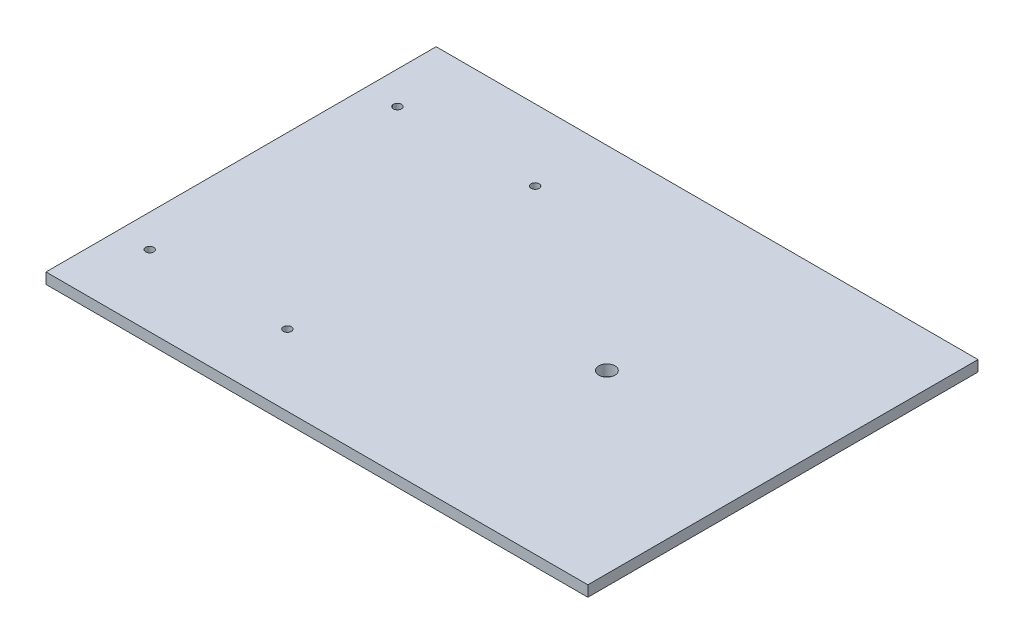
ISO-10303-21;
HEADER;
FILE_DESCRIPTION(('STEP AP214'),'2;1');
FILE_NAME('part.step','',(''),(''),'','','');
FILE_SCHEMA(('AUTOMOTIVE_DESIGN { 1 0 10303 214 1 1 1 1 }'));
ENDSEC;
DATA;
#1=APPLICATION_CONTEXT('core data for automotive mechanical design processes');
#2=APPLICATION_PROTOCOL_DEFINITION('international standard','automotive_design',2000,#1);
#3=PRODUCT_CONTEXT('',#1,'mechanical');
#4=PRODUCT('Part','Part','',(#3));
#5=PRODUCT_RELATED_PRODUCT_CATEGORY('part','',(#4));
#6=PRODUCT_DEFINITION_FORMATION('','',#4);
#7=PRODUCT_DEFINITION_CONTEXT('part definition',#1,'design');
#8=PRODUCT_DEFINITION('design','',#6,#7);
#9=PRODUCT_DEFINITION_SHAPE('','',#8);
#10=(LENGTH_UNIT() NAMED_UNIT(*) SI_UNIT(.MILLI.,.METRE.));
#11=(NAMED_UNIT(*) PLANE_ANGLE_UNIT() SI_UNIT($,.RADIAN.));
#12=(NAMED_UNIT(*) SI_UNIT($,.STERADIAN.) SOLID_ANGLE_UNIT());
#13=UNCERTAINTY_MEASURE_WITH_UNIT(LENGTH_MEASURE(1.E-05),#10,'distance_accuracy_value','');
#14=(GEOMETRIC_REPRESENTATION_CONTEXT(3) GLOBAL_UNCERTAINTY_ASSIGNED_CONTEXT((#13)) GLOBAL_UNIT_ASSIGNED_CONTEXT((#10,
#11,#12)) REPRESENTATION_CONTEXT('',''));
#15=CARTESIAN_POINT('',(0.,0.,0.));
#16=DIRECTION('',(0.,0.,1.));
#17=DIRECTION('',(1.,0.,0.));
#18=AXIS2_PLACEMENT_3D('',#15,#16,#17);
#19=CARTESIAN_POINT('',(-100.,4.,72.));
#20=DIRECTION('',(1.,0.,0.));
#21=DIRECTION('',(0.,0.,-1.));
#22=AXIS2_PLACEMENT_3D('',#19,#20,#21);
#23=PLANE('',#22);
#24=DIRECTION('',(0.,0.,1.));
#25=VECTOR('',#24,1.);
#26=CARTESIAN_POINT('',(-100.,0.,72.));
#27=LINE('',#26,#25);
#28=CARTESIAN_POINT('',(-100.,0.,-72.));
#29=VERTEX_POINT('',#28);
#30=CARTESIAN_POINT('',(-100.,0.,72.));
#31=VERTEX_POINT('',#30);
#32=EDGE_CURVE('E117',#29,#31,#27,.T.);
#33=ORIENTED_EDGE('',*,*,#32,.T.);
#34=DIRECTION('',(0.,-1.,0.));
#35=VECTOR('',#34,1.);
#36=CARTESIAN_POINT('',(-100.,4.,72.));
#37=LINE('',#36,#35);
#38=CARTESIAN_POINT('',(-100.,4.,72.));
#39=VERTEX_POINT('',#38);
#40=EDGE_CURVE('E12',#39,#31,#37,.T.);
#41=ORIENTED_EDGE('',*,*,#40,.F.);
#42=DIRECTION('',(0.,0.,1.));
#43=VECTOR('',#42,1.);
#44=CARTESIAN_POINT('',(-100.,4.,72.));
#45=LINE('',#44,#43);
#46=CARTESIAN_POINT('',(-100.,4.,-72.));
#47=VERTEX_POINT('',#46);
#48=EDGE_CURVE('E97',#47,#39,#45,.T.);
#49=ORIENTED_EDGE('',*,*,#48,.F.);
#50=DIRECTION('',(0.,-1.,0.));
#51=VECTOR('',#50,1.);
#52=CARTESIAN_POINT('',(-100.,4.,-72.));
#53=LINE('',#52,#51);
#54=EDGE_CURVE('E110',#47,#29,#53,.T.);
#55=ORIENTED_EDGE('',*,*,#54,.T.);
#56=EDGE_LOOP('',(#33,#41,#49,#55));
#57=FACE_BOUND('',#56,.T.);
#58=ADVANCED_FACE('F45',(#57),#23,.F.);
#59=CARTESIAN_POINT('',(100.,4.,72.));
#60=DIRECTION('',(0.,0.,-1.));
#61=DIRECTION('',(-1.,0.,0.));
#62=AXIS2_PLACEMENT_3D('',#59,#60,#61);
#63=PLANE('',#62);
#64=DIRECTION('',(1.,0.,0.));
#65=VECTOR('',#64,1.);
#66=CARTESIAN_POINT('',(100.,0.,72.));
#67=LINE('',#66,#65);
#68=CARTESIAN_POINT('',(100.,0.,72.));
#69=VERTEX_POINT('',#68);
#70=EDGE_CURVE('E102',#31,#69,#67,.T.);
#71=ORIENTED_EDGE('',*,*,#70,.T.);
#72=DIRECTION('',(0.,-1.,0.));
#73=VECTOR('',#72,1.);
#74=CARTESIAN_POINT('',(100.,4.,72.));
#75=LINE('',#74,#73);
#76=CARTESIAN_POINT('',(100.,4.,72.));
#77=VERTEX_POINT('',#76);
#78=EDGE_CURVE('E54',#77,#69,#75,.T.);
#79=ORIENTED_EDGE('',*,*,#78,.F.);
#80=DIRECTION('',(1.,0.,0.));
#81=VECTOR('',#80,1.);
#82=CARTESIAN_POINT('',(100.,4.,72.));
#83=LINE('',#82,#81);
#84=EDGE_CURVE('E92',#39,#77,#83,.T.);
#85=ORIENTED_EDGE('',*,*,#84,.F.);
#86=ORIENTED_EDGE('',*,*,#40,.T.);
#87=EDGE_LOOP('',(#71,#79,#85,#86));
#88=FACE_BOUND('',#87,.T.);
#89=ADVANCED_FACE('F101',(#88),#63,.F.);
#90=CARTESIAN_POINT('',(100.,4.,72.));
#91=DIRECTION('',(-1.,0.,0.));
#92=DIRECTION('',(0.,0.,1.));
#93=AXIS2_PLACEMENT_3D('',#90,#91,#92);
#94=PLANE('',#93);
#95=DIRECTION('',(0.,0.,-1.));
#96=VECTOR('',#95,1.);
#97=CARTESIAN_POINT('',(100.,0.,72.));
#98=LINE('',#97,#96);
#99=CARTESIAN_POINT('',(100.,0.,-72.));
#100=VERTEX_POINT('',#99);
#101=EDGE_CURVE('E79',#69,#100,#98,.T.);
#102=ORIENTED_EDGE('',*,*,#101,.T.);
#103=DIRECTION('',(0.,-1.,0.));
#104=VECTOR('',#103,1.);
#105=CARTESIAN_POINT('',(100.,4.,-72.));
#106=LINE('',#105,#104);
#107=CARTESIAN_POINT('',(100.,4.,-72.));
#108=VERTEX_POINT('',#107);
#109=EDGE_CURVE('E104',#108,#100,#106,.T.);
#110=ORIENTED_EDGE('',*,*,#109,.F.);
#111=DIRECTION('',(0.,0.,-1.));
#112=VECTOR('',#111,1.);
#113=CARTESIAN_POINT('',(100.,4.,72.));
#114=LINE('',#113,#112);
#115=EDGE_CURVE('E95',#77,#108,#114,.T.);
#116=ORIENTED_EDGE('',*,*,#115,.F.);
#117=ORIENTED_EDGE('',*,*,#78,.T.);
#118=EDGE_LOOP('',(#102,#110,#116,#117));
#119=FACE_BOUND('',#118,.T.);
#120=ADVANCED_FACE('F105',(#119),#94,.F.);
#121=CARTESIAN_POINT('',(100.,4.,-72.));
#122=DIRECTION('',(0.,0.,1.));
#123=DIRECTION('',(1.,0.,0.));
#124=AXIS2_PLACEMENT_3D('',#121,#122,#123);
#125=PLANE('',#124);
#126=DIRECTION('',(-1.,0.,0.));
#127=VECTOR('',#126,1.);
#128=CARTESIAN_POINT('',(100.,0.,-72.));
#129=LINE('',#128,#127);
#130=EDGE_CURVE('E85',#100,#29,#129,.T.);
#131=ORIENTED_EDGE('',*,*,#130,.T.);
#132=ORIENTED_EDGE('',*,*,#54,.F.);
#133=DIRECTION('',(-1.,0.,0.));
#134=VECTOR('',#133,1.);
#135=CARTESIAN_POINT('',(100.,4.,-72.));
#136=LINE('',#135,#134);
#137=EDGE_CURVE('E62',#108,#47,#136,.T.);
#138=ORIENTED_EDGE('',*,*,#137,.F.);
#139=ORIENTED_EDGE('',*,*,#109,.T.);
#140=EDGE_LOOP('',(#131,#132,#138,#139));
#141=FACE_BOUND('',#140,.T.);
#142=ADVANCED_FACE('F216',(#141),#125,.F.);
#143=CARTESIAN_POINT('',(0.,4.,0.));
#144=DIRECTION('',(0.,1.,0.));
#145=DIRECTION('',(0.,0.,1.));
#146=AXIS2_PLACEMENT_3D('',#143,#144,#145);
#147=PLANE('',#146);
#148=CARTESIAN_POINT('',(35.,4.,0.));
#149=DIRECTION('',(0.,1.,0.));
#150=DIRECTION('',(0.,0.,1.));
#151=AXIS2_PLACEMENT_3D('',#148,#149,#150);
#152=CIRCLE('',#151,3.);
#153=CARTESIAN_POINT('',(35.,4.,3.00000000000003));
#154=VERTEX_POINT('',#153);
#155=EDGE_CURVE('E150',#154,#154,#152,.T.);
#156=ORIENTED_EDGE('',*,*,#155,.F.);
#157=EDGE_LOOP('',(#156));
#158=FACE_BOUND('',#157,.T.);
#159=CARTESIAN_POINT('',(-88.,4.,-45.72));
#160=DIRECTION('',(0.,1.,0.));
#161=DIRECTION('',(0.,0.,1.));
#162=AXIS2_PLACEMENT_3D('',#159,#160,#161);
#163=CIRCLE('',#162,1.49145297546497);
#164=CARTESIAN_POINT('',(-88.,4.,-44.228547024535));
#165=VERTEX_POINT('',#164);
#166=EDGE_CURVE('E188',#165,#165,#163,.T.);
#167=ORIENTED_EDGE('',*,*,#166,.F.);
#168=EDGE_LOOP('',(#167));
#169=FACE_BOUND('',#168,.T.);
#170=CARTESIAN_POINT('',(-37.2,4.,-45.72));
#171=DIRECTION('',(0.,1.,0.));
#172=DIRECTION('',(0.,0.,1.));
#173=AXIS2_PLACEMENT_3D('',#170,#171,#172);
#174=CIRCLE('',#173,1.49145297546497);
#175=CARTESIAN_POINT('',(-37.2,4.,-44.228547024535));
#176=VERTEX_POINT('',#175);
#177=EDGE_CURVE('E132',#176,#176,#174,.T.);
#178=ORIENTED_EDGE('',*,*,#177,.F.);
#179=EDGE_LOOP('',(#178));
#180=FACE_BOUND('',#179,.T.);
#181=CARTESIAN_POINT('',(-37.2,4.,45.72));
#182=DIRECTION('',(0.,1.,0.));
#183=DIRECTION('',(0.,0.,1.));
#184=AXIS2_PLACEMENT_3D('',#181,#182,#183);
#185=CIRCLE('',#184,1.49145297546497);
#186=CARTESIAN_POINT('',(-37.2,4.,47.211452975465));
#187=VERTEX_POINT('',#186);
#188=EDGE_CURVE('E178',#187,#187,#185,.T.);
#189=ORIENTED_EDGE('',*,*,#188,.F.);
#190=EDGE_LOOP('',(#189));
#191=FACE_BOUND('',#190,.T.);
#192=CARTESIAN_POINT('',(-88.,4.,45.72));
#193=DIRECTION('',(0.,1.,0.));
#194=DIRECTION('',(0.,0.,1.));
#195=AXIS2_PLACEMENT_3D('',#192,#193,#194);
#196=CIRCLE('',#195,1.49145297546497);
#197=CARTESIAN_POINT('',(-88.,4.,47.211452975465));
#198=VERTEX_POINT('',#197);
#199=EDGE_CURVE('E166',#198,#198,#196,.T.);
#200=ORIENTED_EDGE('',*,*,#199,.F.);
#201=EDGE_LOOP('',(#200));
#202=FACE_BOUND('',#201,.T.);
#203=ORIENTED_EDGE('',*,*,#48,.T.);
#204=ORIENTED_EDGE('',*,*,#84,.T.);
#205=ORIENTED_EDGE('',*,*,#115,.T.);
#206=ORIENTED_EDGE('',*,*,#137,.T.);
#207=EDGE_LOOP('',(#203,#204,#205,#206));
#208=FACE_BOUND('',#207,.T.);
#209=ADVANCED_FACE('F93',(#158,#169,#180,#191,#202,#208),#147,.T.);
#210=CARTESIAN_POINT('',(0.,0.,0.));
#211=DIRECTION('',(0.,1.,0.));
#212=DIRECTION('',(0.,0.,1.));
#213=AXIS2_PLACEMENT_3D('',#210,#211,#212);
#214=PLANE('',#213);
#215=CARTESIAN_POINT('',(35.,0.,0.));
#216=DIRECTION('',(0.,1.,0.));
#217=DIRECTION('',(0.,0.,1.));
#218=AXIS2_PLACEMENT_3D('',#215,#216,#217);
#219=CIRCLE('',#218,3.);
#220=CARTESIAN_POINT('',(35.,0.,3.00000000000003));
#221=VERTEX_POINT('',#220);
#222=EDGE_CURVE('E155',#221,#221,#219,.T.);
#223=ORIENTED_EDGE('',*,*,#222,.T.);
#224=EDGE_LOOP('',(#223));
#225=FACE_BOUND('',#224,.T.);
#226=CARTESIAN_POINT('',(-88.,0.,-45.72));
#227=DIRECTION('',(0.,1.,0.));
#228=DIRECTION('',(0.,0.,1.));
#229=AXIS2_PLACEMENT_3D('',#226,#227,#228);
#230=CIRCLE('',#229,1.49145297546497);
#231=CARTESIAN_POINT('',(-88.,0.,-44.228547024535));
#232=VERTEX_POINT('',#231);
#233=EDGE_CURVE('E156',#232,#232,#230,.T.);
#234=ORIENTED_EDGE('',*,*,#233,.T.);
#235=EDGE_LOOP('',(#234));
#236=FACE_BOUND('',#235,.T.);
#237=CARTESIAN_POINT('',(-37.2,0.,-45.72));
#238=DIRECTION('',(0.,1.,0.));
#239=DIRECTION('',(0.,0.,1.));
#240=AXIS2_PLACEMENT_3D('',#237,#238,#239);
#241=CIRCLE('',#240,1.49145297546497);
#242=CARTESIAN_POINT('',(-37.2,0.,-44.228547024535));
#243=VERTEX_POINT('',#242);
#244=EDGE_CURVE('E137',#243,#243,#241,.T.);
#245=ORIENTED_EDGE('',*,*,#244,.T.);
#246=EDGE_LOOP('',(#245));
#247=FACE_BOUND('',#246,.T.);
#248=CARTESIAN_POINT('',(-37.2,0.,45.72));
#249=DIRECTION('',(0.,1.,0.));
#250=DIRECTION('',(0.,0.,1.));
#251=AXIS2_PLACEMENT_3D('',#248,#249,#250);
#252=CIRCLE('',#251,1.49145297546497);
#253=CARTESIAN_POINT('',(-37.2,0.,47.211452975465));
#254=VERTEX_POINT('',#253);
#255=EDGE_CURVE('E138',#254,#254,#252,.T.);
#256=ORIENTED_EDGE('',*,*,#255,.T.);
#257=EDGE_LOOP('',(#256));
#258=FACE_BOUND('',#257,.T.);
#259=CARTESIAN_POINT('',(-88.,0.,45.72));
#260=DIRECTION('',(0.,1.,0.));
#261=DIRECTION('',(0.,0.,1.));
#262=AXIS2_PLACEMENT_3D('',#259,#260,#261);
#263=CIRCLE('',#262,1.49145297546497);
#264=CARTESIAN_POINT('',(-88.,0.,47.211452975465));
#265=VERTEX_POINT('',#264);
#266=EDGE_CURVE('E170',#265,#265,#263,.T.);
#267=ORIENTED_EDGE('',*,*,#266,.T.);
#268=EDGE_LOOP('',(#267));
#269=FACE_BOUND('',#268,.T.);
#270=ORIENTED_EDGE('',*,*,#32,.F.);
#271=ORIENTED_EDGE('',*,*,#130,.F.);
#272=ORIENTED_EDGE('',*,*,#101,.F.);
#273=ORIENTED_EDGE('',*,*,#70,.F.);
#274=EDGE_LOOP('',(#270,#271,#272,#273));
#275=FACE_BOUND('',#274,.T.);
#276=ADVANCED_FACE('F203',(#225,#236,#247,#258,#269,#275),#214,.F.);
#277=CARTESIAN_POINT('',(-88.,0.,45.72));
#278=DIRECTION('',(0.,1.,0.));
#279=DIRECTION('',(0.,0.,1.));
#280=AXIS2_PLACEMENT_3D('',#277,#278,#279);
#281=CYLINDRICAL_SURFACE('',#280,1.49145297546497);
#282=ORIENTED_EDGE('',*,*,#266,.F.);
#283=EDGE_LOOP('',(#282));
#284=FACE_BOUND('',#283,.T.);
#285=ORIENTED_EDGE('',*,*,#199,.T.);
#286=EDGE_LOOP('',(#285));
#287=FACE_BOUND('',#286,.T.);
#288=ADVANCED_FACE('F223',(#284,#287),#281,.F.);
#289=CARTESIAN_POINT('',(-37.2,0.,45.72));
#290=DIRECTION('',(0.,1.,0.));
#291=DIRECTION('',(0.,0.,1.));
#292=AXIS2_PLACEMENT_3D('',#289,#290,#291);
#293=CYLINDRICAL_SURFACE('',#292,1.49145297546497);
#294=ORIENTED_EDGE('',*,*,#255,.F.);
#295=EDGE_LOOP('',(#294));
#296=FACE_BOUND('',#295,.T.);
#297=ORIENTED_EDGE('',*,*,#188,.T.);
#298=EDGE_LOOP('',(#297));
#299=FACE_BOUND('',#298,.T.);
#300=ADVANCED_FACE('F210',(#296,#299),#293,.F.);
#301=CARTESIAN_POINT('',(-37.2,0.,-45.72));
#302=DIRECTION('',(0.,1.,0.));
#303=DIRECTION('',(0.,0.,1.));
#304=AXIS2_PLACEMENT_3D('',#301,#302,#303);
#305=CYLINDRICAL_SURFACE('',#304,1.49145297546497);
#306=ORIENTED_EDGE('',*,*,#244,.F.);
#307=EDGE_LOOP('',(#306));
#308=FACE_BOUND('',#307,.T.);
#309=ORIENTED_EDGE('',*,*,#177,.T.);
#310=EDGE_LOOP('',(#309));
#311=FACE_BOUND('',#310,.T.);
#312=ADVANCED_FACE('F206',(#308,#311),#305,.F.);
#313=CARTESIAN_POINT('',(-88.,0.,-45.72));
#314=DIRECTION('',(0.,1.,0.));
#315=DIRECTION('',(0.,0.,1.));
#316=AXIS2_PLACEMENT_3D('',#313,#314,#315);
#317=CYLINDRICAL_SURFACE('',#316,1.49145297546497);
#318=ORIENTED_EDGE('',*,*,#233,.F.);
#319=EDGE_LOOP('',(#318));
#320=FACE_BOUND('',#319,.T.);
#321=ORIENTED_EDGE('',*,*,#166,.T.);
#322=EDGE_LOOP('',(#321));
#323=FACE_BOUND('',#322,.T.);
#324=ADVANCED_FACE('F209',(#320,#323),#317,.F.);
#325=CARTESIAN_POINT('',(35.,0.,0.));
#326=DIRECTION('',(0.,1.,0.));
#327=DIRECTION('',(0.,0.,1.));
#328=AXIS2_PLACEMENT_3D('',#325,#326,#327);
#329=CYLINDRICAL_SURFACE('',#328,3.);
#330=ORIENTED_EDGE('',*,*,#222,.F.);
#331=EDGE_LOOP('',(#330));
#332=FACE_BOUND('',#331,.T.);
#333=ORIENTED_EDGE('',*,*,#155,.T.);
#334=EDGE_LOOP('',(#333));
#335=FACE_BOUND('',#334,.T.);
#336=ADVANCED_FACE('F252',(#332,#335),#329,.F.);
#337=CLOSED_SHELL('',(#58,#89,#120,#142,#209,#276,#288,#300,#312,#324,#336));
#338=MANIFOLD_SOLID_BREP('B2',#337);
#339=ADVANCED_BREP_SHAPE_REPRESENTATION('',(#18,#338),#14);
#340=SHAPE_DEFINITION_REPRESENTATION(#9,#339);
ENDSEC;
END-ISO-10303-21;
